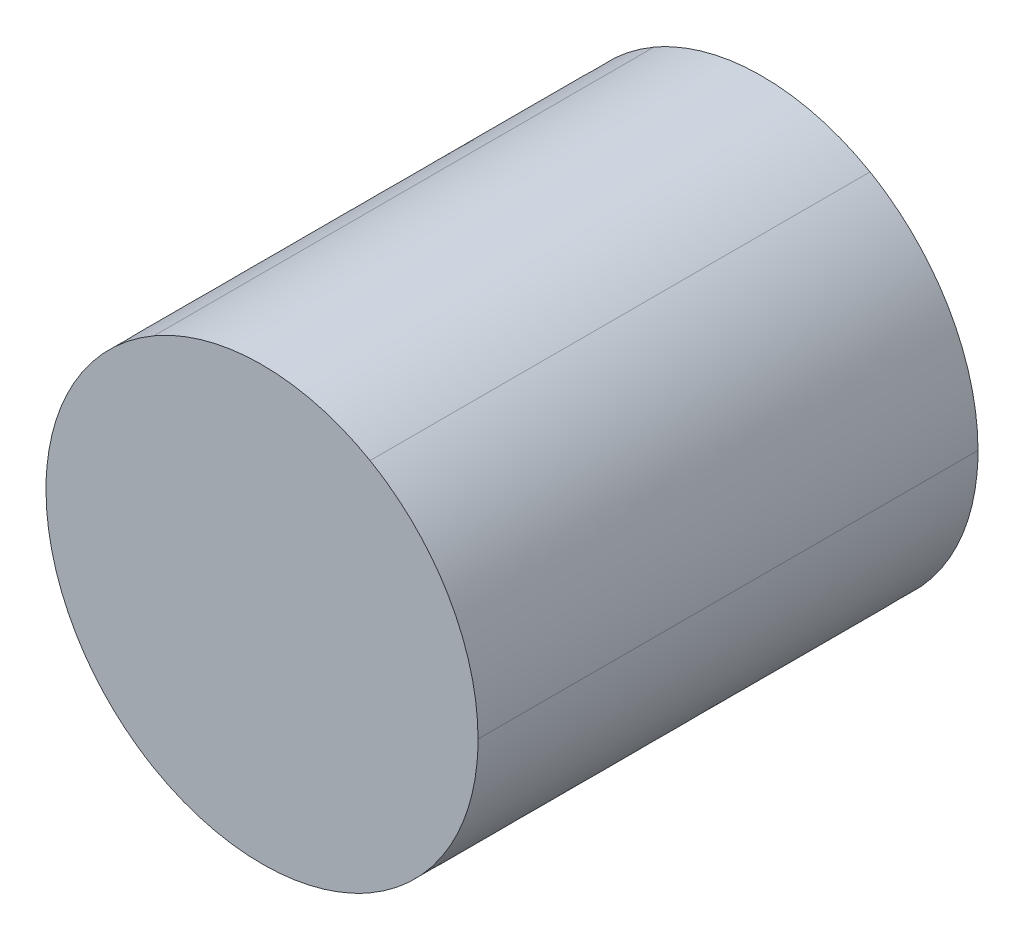
ISO-10303-21;
HEADER;
FILE_DESCRIPTION(('STEP AP214'),'2;1');
FILE_NAME('part.step','',(''),(''),'','','');
FILE_SCHEMA(('AUTOMOTIVE_DESIGN { 1 0 10303 214 1 1 1 1 }'));
ENDSEC;
DATA;
#1=APPLICATION_CONTEXT('core data for automotive mechanical design processes');
#2=APPLICATION_PROTOCOL_DEFINITION('international standard','automotive_design',2000,#1);
#3=PRODUCT_CONTEXT('',#1,'mechanical');
#4=PRODUCT('Part','Part','',(#3));
#5=PRODUCT_RELATED_PRODUCT_CATEGORY('part','',(#4));
#6=PRODUCT_DEFINITION_FORMATION('','',#4);
#7=PRODUCT_DEFINITION_CONTEXT('part definition',#1,'design');
#8=PRODUCT_DEFINITION('design','',#6,#7);
#9=PRODUCT_DEFINITION_SHAPE('','',#8);
#10=(LENGTH_UNIT() NAMED_UNIT(*) SI_UNIT(.MILLI.,.METRE.));
#11=(NAMED_UNIT(*) PLANE_ANGLE_UNIT() SI_UNIT($,.RADIAN.));
#12=(NAMED_UNIT(*) SI_UNIT($,.STERADIAN.) SOLID_ANGLE_UNIT());
#13=UNCERTAINTY_MEASURE_WITH_UNIT(LENGTH_MEASURE(1.E-05),#10,'distance_accuracy_value','');
#14=(GEOMETRIC_REPRESENTATION_CONTEXT(3) GLOBAL_UNCERTAINTY_ASSIGNED_CONTEXT((#13)) GLOBAL_UNIT_ASSIGNED_CONTEXT((#10,
#11,#12)) REPRESENTATION_CONTEXT('',''));
#15=CARTESIAN_POINT('',(0.,0.,0.));
#16=DIRECTION('',(0.,0.,1.));
#17=DIRECTION('',(1.,0.,0.));
#18=AXIS2_PLACEMENT_3D('',#15,#16,#17);
#19=CARTESIAN_POINT('',(74.1664182988689,167.96774742473,6.35));
#20=CARTESIAN_POINT('',(74.1670782988689,168.94841642473,6.35));
#21=CARTESIAN_POINT('',(73.6442762988689,169.85487442473,6.35));
#22=CARTESIAN_POINT('',(72.7951012988689,170.34539942473,6.35));
#23=B_SPLINE_CURVE_WITH_KNOTS('',3,(#19,#20,#21,#22),.UNSPECIFIED.,.F.,.F.,(4,4),(0.,1.),.UNSPECIFIED.);
#24=DIRECTION('',(0.,0.,-1.));
#25=VECTOR('',#24,1.);
#26=SURFACE_OF_LINEAR_EXTRUSION('',#23,#25);
#27=CARTESIAN_POINT('',(74.1664182988689,167.96774742473,0.));
#28=CARTESIAN_POINT('',(74.1670782988689,168.94841642473,0.));
#29=CARTESIAN_POINT('',(73.6442762988689,169.85487442473,0.));
#30=CARTESIAN_POINT('',(72.7951012988689,170.34539942473,0.));
#31=B_SPLINE_CURVE_WITH_KNOTS('',3,(#27,#28,#29,#30),.UNSPECIFIED.,.F.,.F.,(4,4),(0.,1.),.UNSPECIFIED.);
#32=CARTESIAN_POINT('',(74.1664182988689,167.96774742473,0.));
#33=VERTEX_POINT('',#32);
#34=CARTESIAN_POINT('',(72.7951012988689,170.34539942473,0.));
#35=VERTEX_POINT('',#34);
#36=EDGE_CURVE('E187',#33,#35,#31,.T.);
#37=ORIENTED_EDGE('',*,*,#36,.T.);
#38=DIRECTION('',(0.,0.,-1.));
#39=VECTOR('',#38,1.);
#40=CARTESIAN_POINT('',(72.7951012988689,170.34539942473,6.35));
#41=LINE('',#40,#39);
#42=CARTESIAN_POINT('',(72.7951012988689,170.34539942473,6.35));
#43=VERTEX_POINT('',#42);
#44=EDGE_CURVE('E11',#43,#35,#41,.T.);
#45=ORIENTED_EDGE('',*,*,#44,.F.);
#46=CARTESIAN_POINT('',(74.1664182988689,167.96774742473,6.35));
#47=VERTEX_POINT('',#46);
#48=EDGE_CURVE('E154',#47,#43,#23,.T.);
#49=ORIENTED_EDGE('',*,*,#48,.F.);
#50=DIRECTION('',(0.,0.,-1.));
#51=VECTOR('',#50,1.);
#52=CARTESIAN_POINT('',(74.1664182988689,167.96774742473,6.35));
#53=LINE('',#52,#51);
#54=EDGE_CURVE('E116',#47,#33,#53,.T.);
#55=ORIENTED_EDGE('',*,*,#54,.T.);
#56=EDGE_LOOP('',(#37,#45,#49,#55));
#57=FACE_BOUND('',#56,.T.);
#58=ADVANCED_FACE('F35',(#57),#26,.F.);
#59=CARTESIAN_POINT('',(72.7951012988689,170.34539942473,6.35));
#60=CARTESIAN_POINT('',(71.9459272988689,170.83592442473,6.35));
#61=CARTESIAN_POINT('',(70.8995102988689,170.83592442473,6.35));
#62=CARTESIAN_POINT('',(70.0503352988689,170.34539942473,6.35));
#63=B_SPLINE_CURVE_WITH_KNOTS('',3,(#59,#60,#61,#62),.UNSPECIFIED.,.F.,.F.,(4,4),(0.,1.),.UNSPECIFIED.);
#64=DIRECTION('',(0.,0.,-1.));
#65=VECTOR('',#64,1.);
#66=SURFACE_OF_LINEAR_EXTRUSION('',#63,#65);
#67=CARTESIAN_POINT('',(72.7951012988689,170.34539942473,0.));
#68=CARTESIAN_POINT('',(71.9459272988689,170.83592442473,0.));
#69=CARTESIAN_POINT('',(70.8995102988689,170.83592442473,0.));
#70=CARTESIAN_POINT('',(70.0503352988689,170.34539942473,0.));
#71=B_SPLINE_CURVE_WITH_KNOTS('',3,(#67,#68,#69,#70),.UNSPECIFIED.,.F.,.F.,(4,4),(0.,1.),.UNSPECIFIED.);
#72=CARTESIAN_POINT('',(70.0503352988689,170.34539942473,0.));
#73=VERTEX_POINT('',#72);
#74=EDGE_CURVE('E185',#35,#73,#71,.T.);
#75=ORIENTED_EDGE('',*,*,#74,.T.);
#76=DIRECTION('',(0.,0.,-1.));
#77=VECTOR('',#76,1.);
#78=CARTESIAN_POINT('',(70.0503352988689,170.34539942473,6.35));
#79=LINE('',#78,#77);
#80=CARTESIAN_POINT('',(70.0503352988689,170.34539942473,6.35));
#81=VERTEX_POINT('',#80);
#82=EDGE_CURVE('E44',#81,#73,#79,.T.);
#83=ORIENTED_EDGE('',*,*,#82,.F.);
#84=EDGE_CURVE('E89',#43,#81,#63,.T.);
#85=ORIENTED_EDGE('',*,*,#84,.F.);
#86=ORIENTED_EDGE('',*,*,#44,.T.);
#87=EDGE_LOOP('',(#75,#83,#85,#86));
#88=FACE_BOUND('',#87,.T.);
#89=ADVANCED_FACE('F142',(#88),#66,.F.);
#90=CARTESIAN_POINT('',(70.0503352988689,170.34539942473,6.35));
#91=CARTESIAN_POINT('',(69.2011612988689,169.85487442473,6.35));
#92=CARTESIAN_POINT('',(68.6783592988689,168.94841642473,6.35));
#93=CARTESIAN_POINT('',(68.6790192988689,167.96774742473,6.35));
#94=B_SPLINE_CURVE_WITH_KNOTS('',3,(#90,#91,#92,#93),.UNSPECIFIED.,.F.,.F.,(4,4),(0.,1.),.UNSPECIFIED.);
#95=DIRECTION('',(0.,0.,-1.));
#96=VECTOR('',#95,1.);
#97=SURFACE_OF_LINEAR_EXTRUSION('',#94,#96);
#98=CARTESIAN_POINT('',(70.0503352988689,170.34539942473,0.));
#99=CARTESIAN_POINT('',(69.2011612988689,169.85487442473,0.));
#100=CARTESIAN_POINT('',(68.6783592988689,168.94841642473,0.));
#101=CARTESIAN_POINT('',(68.6790192988689,167.96774742473,0.));
#102=B_SPLINE_CURVE_WITH_KNOTS('',3,(#98,#99,#100,#101),.UNSPECIFIED.,.F.,.F.,(4,4),(0.,1.),.UNSPECIFIED.);
#103=CARTESIAN_POINT('',(68.6790192988689,167.96774742473,0.));
#104=VERTEX_POINT('',#103);
#105=EDGE_CURVE('E181',#73,#104,#102,.T.);
#106=ORIENTED_EDGE('',*,*,#105,.T.);
#107=DIRECTION('',(0.,0.,-1.));
#108=VECTOR('',#107,1.);
#109=CARTESIAN_POINT('',(68.6790192988689,167.96774742473,6.35));
#110=LINE('',#109,#108);
#111=CARTESIAN_POINT('',(68.6790192988689,167.96774742473,6.35));
#112=VERTEX_POINT('',#111);
#113=EDGE_CURVE('E111',#112,#104,#110,.T.);
#114=ORIENTED_EDGE('',*,*,#113,.F.);
#115=EDGE_CURVE('E102',#81,#112,#94,.T.);
#116=ORIENTED_EDGE('',*,*,#115,.F.);
#117=ORIENTED_EDGE('',*,*,#82,.T.);
#118=EDGE_LOOP('',(#106,#114,#116,#117));
#119=FACE_BOUND('',#118,.T.);
#120=ADVANCED_FACE('F140',(#119),#97,.F.);
#121=CARTESIAN_POINT('',(68.6790192988689,167.96774742473,6.35));
#122=CARTESIAN_POINT('',(68.6783592988689,166.98707842473,6.35));
#123=CARTESIAN_POINT('',(69.2011612988689,166.08062042473,6.35));
#124=CARTESIAN_POINT('',(70.0503352988689,165.59009542473,6.35));
#125=B_SPLINE_CURVE_WITH_KNOTS('',3,(#121,#122,#123,#124),.UNSPECIFIED.,.F.,.F.,(4,4),(0.,1.),.UNSPECIFIED.);
#126=DIRECTION('',(0.,0.,-1.));
#127=VECTOR('',#126,1.);
#128=SURFACE_OF_LINEAR_EXTRUSION('',#125,#127);
#129=CARTESIAN_POINT('',(68.6790192988689,167.96774742473,0.));
#130=CARTESIAN_POINT('',(68.6783592988689,166.98707842473,0.));
#131=CARTESIAN_POINT('',(69.2011612988689,166.08062042473,0.));
#132=CARTESIAN_POINT('',(70.0503352988689,165.59009542473,0.));
#133=B_SPLINE_CURVE_WITH_KNOTS('',3,(#129,#130,#131,#132),.UNSPECIFIED.,.F.,.F.,(4,4),(0.,1.),.UNSPECIFIED.);
#134=CARTESIAN_POINT('',(70.0503352988689,165.59009542473,0.));
#135=VERTEX_POINT('',#134);
#136=EDGE_CURVE('E110',#104,#135,#133,.T.);
#137=ORIENTED_EDGE('',*,*,#136,.T.);
#138=DIRECTION('',(0.,0.,-1.));
#139=VECTOR('',#138,1.);
#140=CARTESIAN_POINT('',(70.0503352988689,165.59009542473,6.35));
#141=LINE('',#140,#139);
#142=CARTESIAN_POINT('',(70.0503352988689,165.59009542473,6.35));
#143=VERTEX_POINT('',#142);
#144=EDGE_CURVE('E107',#143,#135,#141,.T.);
#145=ORIENTED_EDGE('',*,*,#144,.F.);
#146=EDGE_CURVE('E96',#112,#143,#125,.T.);
#147=ORIENTED_EDGE('',*,*,#146,.F.);
#148=ORIENTED_EDGE('',*,*,#113,.T.);
#149=EDGE_LOOP('',(#137,#145,#147,#148));
#150=FACE_BOUND('',#149,.T.);
#151=ADVANCED_FACE('F108',(#150),#128,.F.);
#152=CARTESIAN_POINT('',(70.0503352988689,165.59009542473,6.35));
#153=CARTESIAN_POINT('',(70.8995102988689,165.09956942473,6.35));
#154=CARTESIAN_POINT('',(71.9459272988689,165.09956942473,6.35));
#155=CARTESIAN_POINT('',(72.7951012988689,165.59009542473,6.35));
#156=B_SPLINE_CURVE_WITH_KNOTS('',3,(#152,#153,#154,#155),.UNSPECIFIED.,.F.,.F.,(4,4),(0.,1.),.UNSPECIFIED.);
#157=DIRECTION('',(0.,0.,-1.));
#158=VECTOR('',#157,1.);
#159=SURFACE_OF_LINEAR_EXTRUSION('',#156,#158);
#160=CARTESIAN_POINT('',(70.0503352988689,165.59009542473,0.));
#161=CARTESIAN_POINT('',(70.8995102988689,165.09956942473,0.));
#162=CARTESIAN_POINT('',(71.9459272988689,165.09956942473,0.));
#163=CARTESIAN_POINT('',(72.7951012988689,165.59009542473,0.));
#164=B_SPLINE_CURVE_WITH_KNOTS('',3,(#160,#161,#162,#163),.UNSPECIFIED.,.F.,.F.,(4,4),(0.,1.),.UNSPECIFIED.);
#165=CARTESIAN_POINT('',(72.7951012988689,165.59009542473,0.));
#166=VERTEX_POINT('',#165);
#167=EDGE_CURVE('E75',#135,#166,#164,.T.);
#168=ORIENTED_EDGE('',*,*,#167,.T.);
#169=DIRECTION('',(0.,0.,-1.));
#170=VECTOR('',#169,1.);
#171=CARTESIAN_POINT('',(72.7951012988689,165.59009542473,6.35));
#172=LINE('',#171,#170);
#173=CARTESIAN_POINT('',(72.7951012988689,165.59009542473,6.35));
#174=VERTEX_POINT('',#173);
#175=EDGE_CURVE('E112',#174,#166,#172,.T.);
#176=ORIENTED_EDGE('',*,*,#175,.F.);
#177=EDGE_CURVE('E100',#143,#174,#156,.T.);
#178=ORIENTED_EDGE('',*,*,#177,.F.);
#179=ORIENTED_EDGE('',*,*,#144,.T.);
#180=EDGE_LOOP('',(#168,#176,#178,#179));
#181=FACE_BOUND('',#180,.T.);
#182=ADVANCED_FACE('F114',(#181),#159,.F.);
#183=CARTESIAN_POINT('',(72.7951012988689,165.59009542473,6.35));
#184=CARTESIAN_POINT('',(73.6442762988689,166.08062042473,6.35));
#185=CARTESIAN_POINT('',(74.1670782988689,166.98707842473,6.35));
#186=CARTESIAN_POINT('',(74.1664182988689,167.96774742473,6.35));
#187=B_SPLINE_CURVE_WITH_KNOTS('',3,(#183,#184,#185,#186),.UNSPECIFIED.,.F.,.F.,(4,4),(0.,1.),.UNSPECIFIED.);
#188=DIRECTION('',(0.,0.,-1.));
#189=VECTOR('',#188,1.);
#190=SURFACE_OF_LINEAR_EXTRUSION('',#187,#189);
#191=CARTESIAN_POINT('',(72.7951012988689,165.59009542473,0.));
#192=CARTESIAN_POINT('',(73.6442762988689,166.08062042473,0.));
#193=CARTESIAN_POINT('',(74.1670782988689,166.98707842473,0.));
#194=CARTESIAN_POINT('',(74.1664182988689,167.96774742473,0.));
#195=B_SPLINE_CURVE_WITH_KNOTS('',3,(#191,#192,#193,#194),.UNSPECIFIED.,.F.,.F.,(4,4),(0.,1.),.UNSPECIFIED.);
#196=EDGE_CURVE('E81',#166,#33,#195,.T.);
#197=ORIENTED_EDGE('',*,*,#196,.T.);
#198=ORIENTED_EDGE('',*,*,#54,.F.);
#199=EDGE_CURVE('E52',#174,#47,#187,.T.);
#200=ORIENTED_EDGE('',*,*,#199,.F.);
#201=ORIENTED_EDGE('',*,*,#175,.T.);
#202=EDGE_LOOP('',(#197,#198,#200,#201));
#203=FACE_BOUND('',#202,.T.);
#204=ADVANCED_FACE('F136',(#203),#190,.F.);
#205=CARTESIAN_POINT('',(73.7994479238689,169.34037742473,6.35));
#206=DIRECTION('',(0.,0.,1.));
#207=DIRECTION('',(1.,0.,0.));
#208=AXIS2_PLACEMENT_3D('',#205,#206,#207);
#209=PLANE('',#208);
#210=ORIENTED_EDGE('',*,*,#48,.T.);
#211=ORIENTED_EDGE('',*,*,#84,.T.);
#212=ORIENTED_EDGE('',*,*,#115,.T.);
#213=ORIENTED_EDGE('',*,*,#146,.T.);
#214=ORIENTED_EDGE('',*,*,#177,.T.);
#215=ORIENTED_EDGE('',*,*,#199,.T.);
#216=EDGE_LOOP('',(#210,#211,#212,#213,#214,#215));
#217=FACE_BOUND('',#216,.T.);
#218=ADVANCED_FACE('F98',(#217),#209,.T.);
#219=CARTESIAN_POINT('',(73.7994479238689,169.34037742473,0.));
#220=DIRECTION('',(0.,0.,1.));
#221=DIRECTION('',(1.,0.,0.));
#222=AXIS2_PLACEMENT_3D('',#219,#220,#221);
#223=PLANE('',#222);
#224=ORIENTED_EDGE('',*,*,#36,.F.);
#225=ORIENTED_EDGE('',*,*,#196,.F.);
#226=ORIENTED_EDGE('',*,*,#167,.F.);
#227=ORIENTED_EDGE('',*,*,#136,.F.);
#228=ORIENTED_EDGE('',*,*,#105,.F.);
#229=ORIENTED_EDGE('',*,*,#74,.F.);
#230=EDGE_LOOP('',(#224,#225,#226,#227,#228,#229));
#231=FACE_BOUND('',#230,.T.);
#232=ADVANCED_FACE('F184',(#231),#223,.F.);
#233=CLOSED_SHELL('',(#58,#89,#120,#151,#182,#204,#218,#232));
#234=MANIFOLD_SOLID_BREP('B2',#233);
#235=ADVANCED_BREP_SHAPE_REPRESENTATION('',(#18,#234),#14);
#236=SHAPE_DEFINITION_REPRESENTATION(#9,#235);
ENDSEC;
END-ISO-10303-21;
